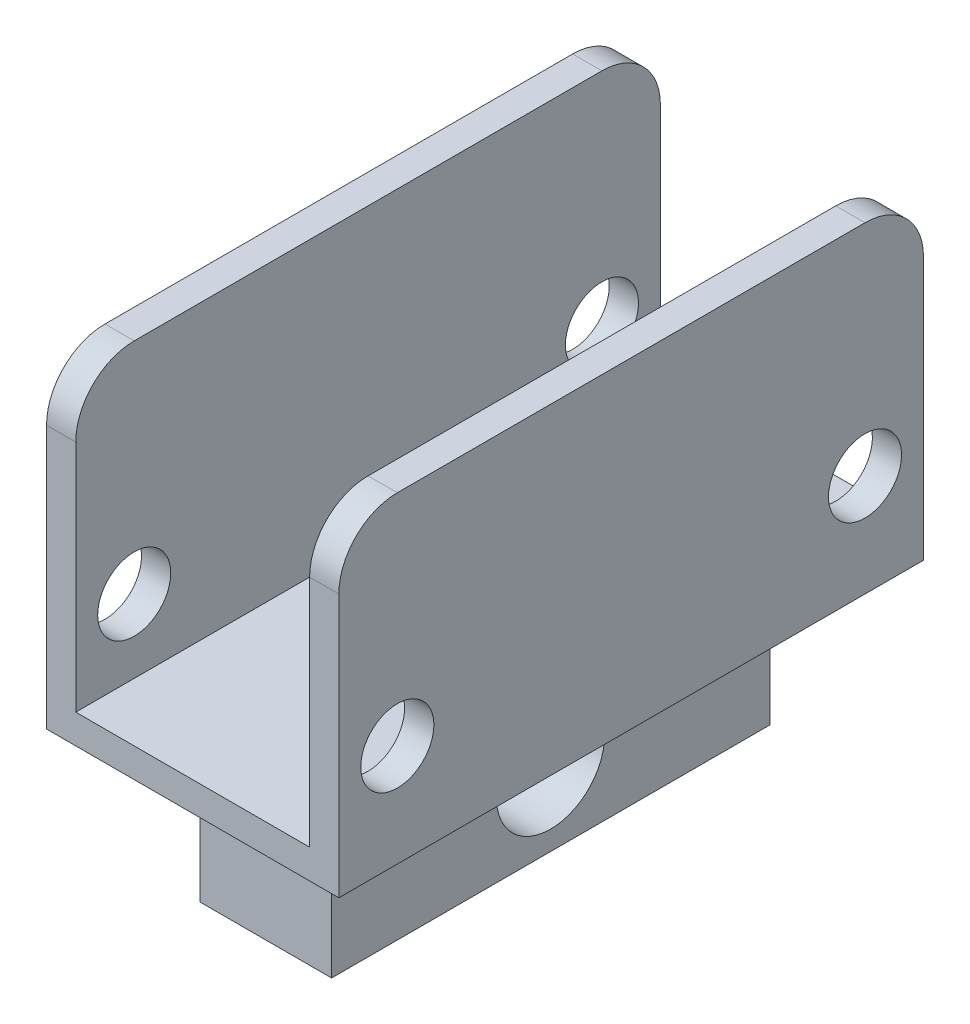
ISO-10303-21;
HEADER;
FILE_DESCRIPTION(('STEP AP214'),'2;1');
FILE_NAME('part.step','',(''),(''),'','','');
FILE_SCHEMA(('AUTOMOTIVE_DESIGN { 1 0 10303 214 1 1 1 1 }'));
ENDSEC;
DATA;
#1=APPLICATION_CONTEXT('core data for automotive mechanical design processes');
#2=APPLICATION_PROTOCOL_DEFINITION('international standard','automotive_design',2000,#1);
#3=PRODUCT_CONTEXT('',#1,'mechanical');
#4=PRODUCT('Part','Part','',(#3));
#5=PRODUCT_RELATED_PRODUCT_CATEGORY('part','',(#4));
#6=PRODUCT_DEFINITION_FORMATION('','',#4);
#7=PRODUCT_DEFINITION_CONTEXT('part definition',#1,'design');
#8=PRODUCT_DEFINITION('design','',#6,#7);
#9=PRODUCT_DEFINITION_SHAPE('','',#8);
#10=(LENGTH_UNIT() NAMED_UNIT(*) SI_UNIT(.MILLI.,.METRE.));
#11=(NAMED_UNIT(*) PLANE_ANGLE_UNIT() SI_UNIT($,.RADIAN.));
#12=(NAMED_UNIT(*) SI_UNIT($,.STERADIAN.) SOLID_ANGLE_UNIT());
#13=UNCERTAINTY_MEASURE_WITH_UNIT(LENGTH_MEASURE(1.E-05),#10,'distance_accuracy_value','');
#14=(GEOMETRIC_REPRESENTATION_CONTEXT(3) GLOBAL_UNCERTAINTY_ASSIGNED_CONTEXT((#13)) GLOBAL_UNIT_ASSIGNED_CONTEXT((#10,
#11,#12)) REPRESENTATION_CONTEXT('',''));
#15=CARTESIAN_POINT('',(0.,0.,0.));
#16=DIRECTION('',(0.,0.,1.));
#17=DIRECTION('',(1.,0.,0.));
#18=AXIS2_PLACEMENT_3D('',#15,#16,#17);
#19=CARTESIAN_POINT('',(10.16,-2.54,50.8));
#20=DIRECTION('',(0.,1.,0.));
#21=DIRECTION('',(0.,0.,1.));
#22=AXIS2_PLACEMENT_3D('',#19,#20,#21);
#23=PLANE('',#22);
#24=DIRECTION('',(1.,0.,0.));
#25=VECTOR('',#24,1.);
#26=CARTESIAN_POINT('',(10.16,-2.54,0.));
#27=LINE('',#26,#25);
#28=CARTESIAN_POINT('',(-12.7,-2.54,0.));
#29=VERTEX_POINT('',#28);
#30=CARTESIAN_POINT('',(12.7,-2.54,0.));
#31=VERTEX_POINT('',#30);
#32=EDGE_CURVE('E215',#29,#31,#27,.T.);
#33=ORIENTED_EDGE('',*,*,#32,.T.);
#34=DIRECTION('',(0.,0.,-1.));
#35=VECTOR('',#34,1.);
#36=CARTESIAN_POINT('',(12.7,-2.54,50.8));
#37=LINE('',#36,#35);
#38=CARTESIAN_POINT('',(12.7,-2.54,50.8));
#39=VERTEX_POINT('',#38);
#40=EDGE_CURVE('E227',#39,#31,#37,.T.);
#41=ORIENTED_EDGE('',*,*,#40,.F.);
#42=DIRECTION('',(1.,0.,0.));
#43=VECTOR('',#42,1.);
#44=CARTESIAN_POINT('',(10.16,-2.54,50.8));
#45=LINE('',#44,#43);
#46=CARTESIAN_POINT('',(-12.7,-2.54,50.8));
#47=VERTEX_POINT('',#46);
#48=EDGE_CURVE('E225',#47,#39,#45,.T.);
#49=ORIENTED_EDGE('',*,*,#48,.F.);
#50=DIRECTION('',(0.,0.,-1.));
#51=VECTOR('',#50,1.);
#52=CARTESIAN_POINT('',(-12.7,-2.54,50.8));
#53=LINE('',#52,#51);
#54=EDGE_CURVE('E243',#47,#29,#53,.T.);
#55=ORIENTED_EDGE('',*,*,#54,.T.);
#56=EDGE_LOOP('',(#33,#41,#49,#55));
#57=FACE_BOUND('',#56,.T.);
#58=DIRECTION('',(0.,0.,1.));
#59=VECTOR('',#58,1.);
#60=CARTESIAN_POINT('',(5.71999999999999,-2.54,6.34999999999999));
#61=LINE('',#60,#59);
#62=CARTESIAN_POINT('',(5.71999999999999,-2.54,6.34999999999999));
#63=VERTEX_POINT('',#62);
#64=CARTESIAN_POINT('',(5.71999999999999,-2.54,44.45));
#65=VERTEX_POINT('',#64);
#66=EDGE_CURVE('E63',#63,#65,#61,.T.);
#67=ORIENTED_EDGE('',*,*,#66,.F.);
#68=DIRECTION('',(1.,0.,0.));
#69=VECTOR('',#68,1.);
#70=CARTESIAN_POINT('',(5.71999999999999,-2.54,6.34999999999999));
#71=LINE('',#70,#69);
#72=CARTESIAN_POINT('',(-5.71999999999999,-2.54,6.34999999999999));
#73=VERTEX_POINT('',#72);
#74=EDGE_CURVE('E67',#73,#63,#71,.T.);
#75=ORIENTED_EDGE('',*,*,#74,.F.);
#76=DIRECTION('',(0.,0.,-1.));
#77=VECTOR('',#76,1.);
#78=CARTESIAN_POINT('',(-5.71999999999999,-2.54,6.34999999999999));
#79=LINE('',#78,#77);
#80=CARTESIAN_POINT('',(-5.71999999999999,-2.54,44.45));
#81=VERTEX_POINT('',#80);
#82=EDGE_CURVE('E578',#81,#73,#79,.T.);
#83=ORIENTED_EDGE('',*,*,#82,.F.);
#84=DIRECTION('',(-1.,0.,0.));
#85=VECTOR('',#84,1.);
#86=CARTESIAN_POINT('',(-5.71999999999999,-2.54,44.45));
#87=LINE('',#86,#85);
#88=EDGE_CURVE('E570',#65,#81,#87,.T.);
#89=ORIENTED_EDGE('',*,*,#88,.F.);
#90=EDGE_LOOP('',(#67,#75,#83,#89));
#91=FACE_BOUND('',#90,.T.);
#92=ADVANCED_FACE('F47',(#57,#91),#23,.F.);
#93=CARTESIAN_POINT('',(12.7,0.,50.8));
#94=DIRECTION('',(-1.,0.,0.));
#95=DIRECTION('',(0.,0.,1.));
#96=AXIS2_PLACEMENT_3D('',#93,#94,#95);
#97=PLANE('',#96);
#98=CARTESIAN_POINT('',(12.7,6.35,45.72));
#99=DIRECTION('',(-1.,0.,0.));
#100=DIRECTION('',(0.,0.,1.));
#101=AXIS2_PLACEMENT_3D('',#98,#99,#100);
#102=CIRCLE('',#101,3.175);
#103=CARTESIAN_POINT('',(12.7,6.35,48.895));
#104=VERTEX_POINT('',#103);
#105=EDGE_CURVE('E190',#104,#104,#102,.T.);
#106=ORIENTED_EDGE('',*,*,#105,.T.);
#107=EDGE_LOOP('',(#106));
#108=FACE_BOUND('',#107,.T.);
#109=CARTESIAN_POINT('',(12.7,6.35,5.08));
#110=DIRECTION('',(-1.,0.,0.));
#111=DIRECTION('',(0.,0.,1.));
#112=AXIS2_PLACEMENT_3D('',#109,#110,#111);
#113=CIRCLE('',#112,3.175);
#114=CARTESIAN_POINT('',(12.7,6.35,8.255));
#115=VERTEX_POINT('',#114);
#116=EDGE_CURVE('E181',#115,#115,#113,.T.);
#117=ORIENTED_EDGE('',*,*,#116,.T.);
#118=EDGE_LOOP('',(#117));
#119=FACE_BOUND('',#118,.T.);
#120=DIRECTION('',(0.,0.,-1.));
#121=VECTOR('',#120,1.);
#122=CARTESIAN_POINT('',(12.7,25.4,50.8));
#123=LINE('',#122,#121);
#124=CARTESIAN_POINT('',(12.7,25.4,45.72));
#125=VERTEX_POINT('',#124);
#126=CARTESIAN_POINT('',(12.7,25.4,5.08));
#127=VERTEX_POINT('',#126);
#128=EDGE_CURVE('E260',#125,#127,#123,.T.);
#129=ORIENTED_EDGE('',*,*,#128,.F.);
#130=CARTESIAN_POINT('',(12.7,20.32,45.72));
#131=DIRECTION('',(-1.,0.,0.));
#132=DIRECTION('',(0.,0.,1.));
#133=AXIS2_PLACEMENT_3D('',#130,#131,#132);
#134=CIRCLE('',#133,5.08);
#135=CARTESIAN_POINT('',(12.7,20.32,50.8));
#136=VERTEX_POINT('',#135);
#137=EDGE_CURVE('E270',#125,#136,#134,.F.);
#138=ORIENTED_EDGE('',*,*,#137,.T.);
#139=DIRECTION('',(0.,1.,0.));
#140=VECTOR('',#139,1.);
#141=CARTESIAN_POINT('',(12.7,0.,50.8));
#142=LINE('',#141,#140);
#143=EDGE_CURVE('E211',#39,#136,#142,.T.);
#144=ORIENTED_EDGE('',*,*,#143,.F.);
#145=ORIENTED_EDGE('',*,*,#40,.T.);
#146=DIRECTION('',(0.,1.,0.));
#147=VECTOR('',#146,1.);
#148=CARTESIAN_POINT('',(12.7,0.,0.));
#149=LINE('',#148,#147);
#150=CARTESIAN_POINT('',(12.7,20.32,0.));
#151=VERTEX_POINT('',#150);
#152=EDGE_CURVE('E210',#31,#151,#149,.T.);
#153=ORIENTED_EDGE('',*,*,#152,.T.);
#154=CARTESIAN_POINT('',(12.7,20.32,5.08));
#155=DIRECTION('',(-1.,0.,0.));
#156=DIRECTION('',(0.,0.,1.));
#157=AXIS2_PLACEMENT_3D('',#154,#155,#156);
#158=CIRCLE('',#157,5.08);
#159=EDGE_CURVE('E268',#151,#127,#158,.F.);
#160=ORIENTED_EDGE('',*,*,#159,.T.);
#161=EDGE_LOOP('',(#129,#138,#144,#145,#153,#160));
#162=FACE_BOUND('',#161,.T.);
#163=ADVANCED_FACE('F305',(#108,#119,#162),#97,.F.);
#164=CARTESIAN_POINT('',(10.16,25.4,50.8));
#165=DIRECTION('',(0.,1.,0.));
#166=DIRECTION('',(0.,0.,1.));
#167=AXIS2_PLACEMENT_3D('',#164,#165,#166);
#168=PLANE('',#167);
#169=DIRECTION('',(0.,0.,-1.));
#170=VECTOR('',#169,1.);
#171=CARTESIAN_POINT('',(10.16,25.4,50.8));
#172=LINE('',#171,#170);
#173=CARTESIAN_POINT('',(10.16,25.4,45.72));
#174=VERTEX_POINT('',#173);
#175=CARTESIAN_POINT('',(10.16,25.4,5.08));
#176=VERTEX_POINT('',#175);
#177=EDGE_CURVE('E257',#174,#176,#172,.T.);
#178=ORIENTED_EDGE('',*,*,#177,.F.);
#179=DIRECTION('',(1.,0.,0.));
#180=VECTOR('',#179,1.);
#181=CARTESIAN_POINT('',(12.7,25.4,45.72));
#182=LINE('',#181,#180);
#183=EDGE_CURVE('E265',#174,#125,#182,.T.);
#184=ORIENTED_EDGE('',*,*,#183,.T.);
#185=ORIENTED_EDGE('',*,*,#128,.T.);
#186=DIRECTION('',(1.,0.,0.));
#187=VECTOR('',#186,1.);
#188=CARTESIAN_POINT('',(10.16,25.4,5.08));
#189=LINE('',#188,#187);
#190=EDGE_CURVE('E263',#127,#176,#189,.F.);
#191=ORIENTED_EDGE('',*,*,#190,.T.);
#192=EDGE_LOOP('',(#178,#184,#185,#191));
#193=FACE_BOUND('',#192,.T.);
#194=ADVANCED_FACE('F344',(#193),#168,.T.);
#195=CARTESIAN_POINT('',(10.16,0.,50.8));
#196=DIRECTION('',(-1.,0.,0.));
#197=DIRECTION('',(0.,0.,1.));
#198=AXIS2_PLACEMENT_3D('',#195,#196,#197);
#199=PLANE('',#198);
#200=CARTESIAN_POINT('',(10.16,6.35,45.72));
#201=DIRECTION('',(-1.,0.,0.));
#202=DIRECTION('',(0.,0.,1.));
#203=AXIS2_PLACEMENT_3D('',#200,#201,#202);
#204=CIRCLE('',#203,3.175);
#205=CARTESIAN_POINT('',(10.16,6.35,48.895));
#206=VERTEX_POINT('',#205);
#207=EDGE_CURVE('E207',#206,#206,#204,.T.);
#208=ORIENTED_EDGE('',*,*,#207,.F.);
#209=EDGE_LOOP('',(#208));
#210=FACE_BOUND('',#209,.T.);
#211=CARTESIAN_POINT('',(10.16,6.35,5.08));
#212=DIRECTION('',(-1.,0.,0.));
#213=DIRECTION('',(0.,0.,1.));
#214=AXIS2_PLACEMENT_3D('',#211,#212,#213);
#215=CIRCLE('',#214,3.175);
#216=CARTESIAN_POINT('',(10.16,6.35,8.255));
#217=VERTEX_POINT('',#216);
#218=EDGE_CURVE('E201',#217,#217,#215,.T.);
#219=ORIENTED_EDGE('',*,*,#218,.F.);
#220=EDGE_LOOP('',(#219));
#221=FACE_BOUND('',#220,.T.);
#222=DIRECTION('',(0.,1.,0.));
#223=VECTOR('',#222,1.);
#224=CARTESIAN_POINT('',(10.16,0.,50.8));
#225=LINE('',#224,#223);
#226=CARTESIAN_POINT('',(10.16,0.,50.8));
#227=VERTEX_POINT('',#226);
#228=CARTESIAN_POINT('',(10.16,20.32,50.8));
#229=VERTEX_POINT('',#228);
#230=EDGE_CURVE('E214',#227,#229,#225,.T.);
#231=ORIENTED_EDGE('',*,*,#230,.T.);
#232=CARTESIAN_POINT('',(10.16,20.32,45.72));
#233=DIRECTION('',(-1.,0.,0.));
#234=DIRECTION('',(0.,0.,1.));
#235=AXIS2_PLACEMENT_3D('',#232,#233,#234);
#236=CIRCLE('',#235,5.08);
#237=EDGE_CURVE('E278',#229,#174,#236,.T.);
#238=ORIENTED_EDGE('',*,*,#237,.T.);
#239=ORIENTED_EDGE('',*,*,#177,.T.);
#240=CARTESIAN_POINT('',(10.16,20.32,5.08));
#241=DIRECTION('',(-1.,0.,0.));
#242=DIRECTION('',(0.,0.,1.));
#243=AXIS2_PLACEMENT_3D('',#240,#241,#242);
#244=CIRCLE('',#243,5.08);
#245=CARTESIAN_POINT('',(10.16,20.32,0.));
#246=VERTEX_POINT('',#245);
#247=EDGE_CURVE('E276',#176,#246,#244,.T.);
#248=ORIENTED_EDGE('',*,*,#247,.T.);
#249=DIRECTION('',(0.,1.,0.));
#250=VECTOR('',#249,1.);
#251=CARTESIAN_POINT('',(10.16,0.,0.));
#252=LINE('',#251,#250);
#253=CARTESIAN_POINT('',(10.16,0.,0.));
#254=VERTEX_POINT('',#253);
#255=EDGE_CURVE('E230',#254,#246,#252,.T.);
#256=ORIENTED_EDGE('',*,*,#255,.F.);
#257=DIRECTION('',(0.,0.,-1.));
#258=VECTOR('',#257,1.);
#259=CARTESIAN_POINT('',(10.16,0.,50.8));
#260=LINE('',#259,#258);
#261=EDGE_CURVE('E255',#227,#254,#260,.T.);
#262=ORIENTED_EDGE('',*,*,#261,.F.);
#263=EDGE_LOOP('',(#231,#238,#239,#248,#256,#262));
#264=FACE_BOUND('',#263,.T.);
#265=ADVANCED_FACE('F340',(#210,#221,#264),#199,.T.);
#266=CARTESIAN_POINT('',(10.16,0.,50.8));
#267=DIRECTION('',(0.,1.,0.));
#268=DIRECTION('',(0.,0.,1.));
#269=AXIS2_PLACEMENT_3D('',#266,#267,#268);
#270=PLANE('',#269);
#271=DIRECTION('',(1.,0.,0.));
#272=VECTOR('',#271,1.);
#273=CARTESIAN_POINT('',(10.16,0.,0.));
#274=LINE('',#273,#272);
#275=CARTESIAN_POINT('',(-10.16,0.,0.));
#276=VERTEX_POINT('',#275);
#277=EDGE_CURVE('E233',#276,#254,#274,.T.);
#278=ORIENTED_EDGE('',*,*,#277,.F.);
#279=DIRECTION('',(0.,0.,-1.));
#280=VECTOR('',#279,1.);
#281=CARTESIAN_POINT('',(-10.16,0.,50.8));
#282=LINE('',#281,#280);
#283=CARTESIAN_POINT('',(-10.16,0.,50.8));
#284=VERTEX_POINT('',#283);
#285=EDGE_CURVE('E252',#284,#276,#282,.T.);
#286=ORIENTED_EDGE('',*,*,#285,.F.);
#287=DIRECTION('',(1.,0.,0.));
#288=VECTOR('',#287,1.);
#289=CARTESIAN_POINT('',(10.16,0.,50.8));
#290=LINE('',#289,#288);
#291=EDGE_CURVE('E218',#284,#227,#290,.T.);
#292=ORIENTED_EDGE('',*,*,#291,.T.);
#293=ORIENTED_EDGE('',*,*,#261,.T.);
#294=EDGE_LOOP('',(#278,#286,#292,#293));
#295=FACE_BOUND('',#294,.T.);
#296=ADVANCED_FACE('F338',(#295),#270,.T.);
#297=CARTESIAN_POINT('',(-10.16,0.,50.8));
#298=DIRECTION('',(1.,0.,0.));
#299=DIRECTION('',(0.,0.,-1.));
#300=AXIS2_PLACEMENT_3D('',#297,#298,#299);
#301=PLANE('',#300);
#302=CARTESIAN_POINT('',(-10.16,6.35,45.72));
#303=DIRECTION('',(1.,0.,0.));
#304=DIRECTION('',(0.,0.,-1.));
#305=AXIS2_PLACEMENT_3D('',#302,#303,#304);
#306=CIRCLE('',#305,3.175);
#307=CARTESIAN_POINT('',(-10.16,6.35,48.895));
#308=VERTEX_POINT('',#307);
#309=EDGE_CURVE('E204',#308,#308,#306,.T.);
#310=ORIENTED_EDGE('',*,*,#309,.F.);
#311=EDGE_LOOP('',(#310));
#312=FACE_BOUND('',#311,.T.);
#313=CARTESIAN_POINT('',(-10.16,6.35,5.08));
#314=DIRECTION('',(1.,0.,0.));
#315=DIRECTION('',(0.,0.,-1.));
#316=AXIS2_PLACEMENT_3D('',#313,#314,#315);
#317=CIRCLE('',#316,3.175);
#318=CARTESIAN_POINT('',(-10.16,6.35,8.255));
#319=VERTEX_POINT('',#318);
#320=EDGE_CURVE('E193',#319,#319,#317,.T.);
#321=ORIENTED_EDGE('',*,*,#320,.F.);
#322=EDGE_LOOP('',(#321));
#323=FACE_BOUND('',#322,.T.);
#324=DIRECTION('',(0.,0.,-1.));
#325=VECTOR('',#324,1.);
#326=CARTESIAN_POINT('',(-10.16,25.4,50.8));
#327=LINE('',#326,#325);
#328=CARTESIAN_POINT('',(-10.16,25.4,45.72));
#329=VERTEX_POINT('',#328);
#330=CARTESIAN_POINT('',(-10.16,25.4,5.08));
#331=VERTEX_POINT('',#330);
#332=EDGE_CURVE('E249',#329,#331,#327,.T.);
#333=ORIENTED_EDGE('',*,*,#332,.F.);
#334=CARTESIAN_POINT('',(-10.16,20.32,45.72));
#335=DIRECTION('',(1.,0.,0.));
#336=DIRECTION('',(0.,0.,-1.));
#337=AXIS2_PLACEMENT_3D('',#334,#335,#336);
#338=CIRCLE('',#337,5.08);
#339=CARTESIAN_POINT('',(-10.16,20.32,50.8));
#340=VERTEX_POINT('',#339);
#341=EDGE_CURVE('E287',#329,#340,#338,.T.);
#342=ORIENTED_EDGE('',*,*,#341,.T.);
#343=DIRECTION('',(0.,-1.,0.));
#344=VECTOR('',#343,1.);
#345=CARTESIAN_POINT('',(-10.16,0.,50.8));
#346=LINE('',#345,#344);
#347=EDGE_CURVE('E221',#340,#284,#346,.T.);
#348=ORIENTED_EDGE('',*,*,#347,.T.);
#349=ORIENTED_EDGE('',*,*,#285,.T.);
#350=DIRECTION('',(0.,-1.,0.));
#351=VECTOR('',#350,1.);
#352=CARTESIAN_POINT('',(-10.16,0.,0.));
#353=LINE('',#352,#351);
#354=CARTESIAN_POINT('',(-10.16,20.32,0.));
#355=VERTEX_POINT('',#354);
#356=EDGE_CURVE('E236',#355,#276,#353,.T.);
#357=ORIENTED_EDGE('',*,*,#356,.F.);
#358=CARTESIAN_POINT('',(-10.16,20.32,5.08));
#359=DIRECTION('',(1.,0.,0.));
#360=DIRECTION('',(0.,0.,-1.));
#361=AXIS2_PLACEMENT_3D('',#358,#359,#360);
#362=CIRCLE('',#361,5.08);
#363=EDGE_CURVE('E285',#355,#331,#362,.T.);
#364=ORIENTED_EDGE('',*,*,#363,.T.);
#365=EDGE_LOOP('',(#333,#342,#348,#349,#357,#364));
#366=FACE_BOUND('',#365,.T.);
#367=ADVANCED_FACE('F320',(#312,#323,#366),#301,.T.);
#368=CARTESIAN_POINT('',(-12.7,25.4,50.8));
#369=DIRECTION('',(0.,1.,0.));
#370=DIRECTION('',(0.,0.,1.));
#371=AXIS2_PLACEMENT_3D('',#368,#369,#370);
#372=PLANE('',#371);
#373=DIRECTION('',(0.,0.,-1.));
#374=VECTOR('',#373,1.);
#375=CARTESIAN_POINT('',(-12.7,25.4,50.8));
#376=LINE('',#375,#374);
#377=CARTESIAN_POINT('',(-12.7,25.4,45.72));
#378=VERTEX_POINT('',#377);
#379=CARTESIAN_POINT('',(-12.7,25.4,5.08));
#380=VERTEX_POINT('',#379);
#381=EDGE_CURVE('E246',#378,#380,#376,.T.);
#382=ORIENTED_EDGE('',*,*,#381,.F.);
#383=DIRECTION('',(1.,0.,0.));
#384=VECTOR('',#383,1.);
#385=CARTESIAN_POINT('',(-10.16,25.4,45.72));
#386=LINE('',#385,#384);
#387=EDGE_CURVE('E282',#378,#329,#386,.T.);
#388=ORIENTED_EDGE('',*,*,#387,.T.);
#389=ORIENTED_EDGE('',*,*,#332,.T.);
#390=DIRECTION('',(1.,0.,0.));
#391=VECTOR('',#390,1.);
#392=CARTESIAN_POINT('',(-12.7,25.4,5.08));
#393=LINE('',#392,#391);
#394=EDGE_CURVE('E280',#331,#380,#393,.F.);
#395=ORIENTED_EDGE('',*,*,#394,.T.);
#396=EDGE_LOOP('',(#382,#388,#389,#395));
#397=FACE_BOUND('',#396,.T.);
#398=ADVANCED_FACE('F323',(#397),#372,.T.);
#399=CARTESIAN_POINT('',(-12.7,0.,50.8));
#400=DIRECTION('',(1.,0.,0.));
#401=DIRECTION('',(0.,0.,-1.));
#402=AXIS2_PLACEMENT_3D('',#399,#400,#401);
#403=PLANE('',#402);
#404=CARTESIAN_POINT('',(-12.7,6.35,45.72));
#405=DIRECTION('',(-1.,0.,0.));
#406=DIRECTION('',(0.,0.,1.));
#407=AXIS2_PLACEMENT_3D('',#404,#405,#406);
#408=CIRCLE('',#407,3.175);
#409=CARTESIAN_POINT('',(-12.7,6.35,48.895));
#410=VERTEX_POINT('',#409);
#411=EDGE_CURVE('E194',#410,#410,#408,.T.);
#412=ORIENTED_EDGE('',*,*,#411,.F.);
#413=EDGE_LOOP('',(#412));
#414=FACE_BOUND('',#413,.T.);
#415=CARTESIAN_POINT('',(-12.7,6.35,5.08));
#416=DIRECTION('',(-1.,0.,0.));
#417=DIRECTION('',(0.,0.,1.));
#418=AXIS2_PLACEMENT_3D('',#415,#416,#417);
#419=CIRCLE('',#418,3.175);
#420=CARTESIAN_POINT('',(-12.7,6.35,8.255));
#421=VERTEX_POINT('',#420);
#422=EDGE_CURVE('E184',#421,#421,#419,.T.);
#423=ORIENTED_EDGE('',*,*,#422,.F.);
#424=EDGE_LOOP('',(#423));
#425=FACE_BOUND('',#424,.T.);
#426=DIRECTION('',(0.,1.,0.));
#427=VECTOR('',#426,1.);
#428=CARTESIAN_POINT('',(-12.7,0.,50.8));
#429=LINE('',#428,#427);
#430=CARTESIAN_POINT('',(-12.7,20.32,50.8));
#431=VERTEX_POINT('',#430);
#432=EDGE_CURVE('E223',#431,#47,#429,.F.);
#433=ORIENTED_EDGE('',*,*,#432,.F.);
#434=CARTESIAN_POINT('',(-12.7,20.32,45.72));
#435=DIRECTION('',(1.,0.,0.));
#436=DIRECTION('',(0.,0.,-1.));
#437=AXIS2_PLACEMENT_3D('',#434,#435,#436);
#438=CIRCLE('',#437,5.08);
#439=EDGE_CURVE('E291',#431,#378,#438,.F.);
#440=ORIENTED_EDGE('',*,*,#439,.T.);
#441=ORIENTED_EDGE('',*,*,#381,.T.);
#442=CARTESIAN_POINT('',(-12.7,20.32,5.08));
#443=DIRECTION('',(1.,0.,0.));
#444=DIRECTION('',(0.,0.,-1.));
#445=AXIS2_PLACEMENT_3D('',#442,#443,#444);
#446=CIRCLE('',#445,5.08);
#447=CARTESIAN_POINT('',(-12.7,20.32,0.));
#448=VERTEX_POINT('',#447);
#449=EDGE_CURVE('E289',#380,#448,#446,.F.);
#450=ORIENTED_EDGE('',*,*,#449,.T.);
#451=DIRECTION('',(0.,1.,0.));
#452=VECTOR('',#451,1.);
#453=CARTESIAN_POINT('',(-12.7,0.,0.));
#454=LINE('',#453,#452);
#455=EDGE_CURVE('E238',#448,#29,#454,.F.);
#456=ORIENTED_EDGE('',*,*,#455,.T.);
#457=ORIENTED_EDGE('',*,*,#54,.F.);
#458=EDGE_LOOP('',(#433,#440,#441,#450,#456,#457));
#459=FACE_BOUND('',#458,.T.);
#460=ADVANCED_FACE('F366',(#414,#425,#459),#403,.F.);
#461=CARTESIAN_POINT('',(0.,0.,50.8));
#462=DIRECTION('',(0.,0.,-1.));
#463=DIRECTION('',(-1.,0.,0.));
#464=AXIS2_PLACEMENT_3D('',#461,#462,#463);
#465=PLANE('',#464);
#466=ORIENTED_EDGE('',*,*,#143,.T.);
#467=DIRECTION('',(1.,0.,0.));
#468=VECTOR('',#467,1.);
#469=CARTESIAN_POINT('',(10.16,20.32,50.8));
#470=LINE('',#469,#468);
#471=EDGE_CURVE('E274',#136,#229,#470,.F.);
#472=ORIENTED_EDGE('',*,*,#471,.T.);
#473=ORIENTED_EDGE('',*,*,#230,.F.);
#474=ORIENTED_EDGE('',*,*,#291,.F.);
#475=ORIENTED_EDGE('',*,*,#347,.F.);
#476=DIRECTION('',(1.,0.,0.));
#477=VECTOR('',#476,1.);
#478=CARTESIAN_POINT('',(-12.7,20.32,50.8));
#479=LINE('',#478,#477);
#480=EDGE_CURVE('E272',#340,#431,#479,.F.);
#481=ORIENTED_EDGE('',*,*,#480,.T.);
#482=ORIENTED_EDGE('',*,*,#432,.T.);
#483=ORIENTED_EDGE('',*,*,#48,.T.);
#484=EDGE_LOOP('',(#466,#472,#473,#474,#475,#481,#482,#483));
#485=FACE_BOUND('',#484,.T.);
#486=ADVANCED_FACE('F333',(#485),#465,.F.);
#487=CARTESIAN_POINT('',(0.,0.,0.));
#488=DIRECTION('',(0.,0.,-1.));
#489=DIRECTION('',(-1.,0.,0.));
#490=AXIS2_PLACEMENT_3D('',#487,#488,#489);
#491=PLANE('',#490);
#492=ORIENTED_EDGE('',*,*,#455,.F.);
#493=DIRECTION('',(1.,0.,0.));
#494=VECTOR('',#493,1.);
#495=CARTESIAN_POINT('',(0.,20.32,0.));
#496=LINE('',#495,#494);
#497=EDGE_CURVE('E11',#448,#355,#496,.T.);
#498=ORIENTED_EDGE('',*,*,#497,.T.);
#499=ORIENTED_EDGE('',*,*,#356,.T.);
#500=ORIENTED_EDGE('',*,*,#277,.T.);
#501=ORIENTED_EDGE('',*,*,#255,.T.);
#502=DIRECTION('',(1.,0.,0.));
#503=VECTOR('',#502,1.);
#504=CARTESIAN_POINT('',(0.,20.32,0.));
#505=LINE('',#504,#503);
#506=EDGE_CURVE('E56',#246,#151,#505,.T.);
#507=ORIENTED_EDGE('',*,*,#506,.T.);
#508=ORIENTED_EDGE('',*,*,#152,.F.);
#509=ORIENTED_EDGE('',*,*,#32,.F.);
#510=EDGE_LOOP('',(#492,#498,#499,#500,#501,#507,#508,#509));
#511=FACE_BOUND('',#510,.T.);
#512=ADVANCED_FACE('F298',(#511),#491,.T.);
#513=CARTESIAN_POINT('',(10.16,20.32,45.72));
#514=DIRECTION('',(-1.,0.,0.));
#515=DIRECTION('',(0.,0.,1.));
#516=AXIS2_PLACEMENT_3D('',#513,#514,#515);
#517=CYLINDRICAL_SURFACE('',#516,5.08);
#518=ORIENTED_EDGE('',*,*,#237,.F.);
#519=ORIENTED_EDGE('',*,*,#471,.F.);
#520=ORIENTED_EDGE('',*,*,#137,.F.);
#521=ORIENTED_EDGE('',*,*,#183,.F.);
#522=EDGE_LOOP('',(#518,#519,#520,#521));
#523=FACE_BOUND('',#522,.T.);
#524=ADVANCED_FACE('F349',(#523),#517,.T.);
#525=CARTESIAN_POINT('',(-12.7,20.32,45.72));
#526=DIRECTION('',(-1.,0.,0.));
#527=DIRECTION('',(0.,0.,1.));
#528=AXIS2_PLACEMENT_3D('',#525,#526,#527);
#529=CYLINDRICAL_SURFACE('',#528,5.08);
#530=ORIENTED_EDGE('',*,*,#439,.F.);
#531=ORIENTED_EDGE('',*,*,#480,.F.);
#532=ORIENTED_EDGE('',*,*,#341,.F.);
#533=ORIENTED_EDGE('',*,*,#387,.F.);
#534=EDGE_LOOP('',(#530,#531,#532,#533));
#535=FACE_BOUND('',#534,.T.);
#536=ADVANCED_FACE('F327',(#535),#529,.T.);
#537=CARTESIAN_POINT('',(0.,20.32,5.08));
#538=DIRECTION('',(1.,0.,0.));
#539=DIRECTION('',(0.,0.,-1.));
#540=AXIS2_PLACEMENT_3D('',#537,#538,#539);
#541=CYLINDRICAL_SURFACE('',#540,5.08);
#542=ORIENTED_EDGE('',*,*,#449,.F.);
#543=ORIENTED_EDGE('',*,*,#394,.F.);
#544=ORIENTED_EDGE('',*,*,#363,.F.);
#545=ORIENTED_EDGE('',*,*,#497,.F.);
#546=EDGE_LOOP('',(#542,#543,#544,#545));
#547=FACE_BOUND('',#546,.T.);
#548=ADVANCED_FACE('F316',(#547),#541,.T.);
#549=CARTESIAN_POINT('',(0.,20.32,5.08));
#550=DIRECTION('',(1.,0.,0.));
#551=DIRECTION('',(0.,0.,-1.));
#552=AXIS2_PLACEMENT_3D('',#549,#550,#551);
#553=CYLINDRICAL_SURFACE('',#552,5.08);
#554=ORIENTED_EDGE('',*,*,#247,.F.);
#555=ORIENTED_EDGE('',*,*,#190,.F.);
#556=ORIENTED_EDGE('',*,*,#159,.F.);
#557=ORIENTED_EDGE('',*,*,#506,.F.);
#558=EDGE_LOOP('',(#554,#555,#556,#557));
#559=FACE_BOUND('',#558,.T.);
#560=ADVANCED_FACE('F49',(#559),#553,.T.);
#561=CARTESIAN_POINT('',(12.7,6.35,5.08));
#562=DIRECTION('',(-1.,0.,0.));
#563=DIRECTION('',(0.,0.,1.));
#564=AXIS2_PLACEMENT_3D('',#561,#562,#563);
#565=CYLINDRICAL_SURFACE('',#564,3.175);
#566=CARTESIAN_POINT('',(-10.16,6.35,8.255));
#567=CARTESIAN_POINT('',(-10.1864583333333,6.35,8.255));
#568=CARTESIAN_POINT('',(-10.2129166666667,6.35,8.255));
#569=CARTESIAN_POINT('',(-10.2658333333333,6.35,8.255));
#570=CARTESIAN_POINT('',(-10.2922916666667,6.35,8.255));
#571=CARTESIAN_POINT('',(-10.3452083333333,6.35,8.255));
#572=CARTESIAN_POINT('',(-10.3716666666667,6.35,8.255));
#573=CARTESIAN_POINT('',(-10.4245833333333,6.35,8.255));
#574=CARTESIAN_POINT('',(-10.4510416666667,6.35,8.255));
#575=CARTESIAN_POINT('',(-10.5039583333333,6.35,8.255));
#576=CARTESIAN_POINT('',(-10.5304166666667,6.35,8.255));
#577=CARTESIAN_POINT('',(-10.5833333333333,6.35,8.255));
#578=CARTESIAN_POINT('',(-10.6097916666667,6.35,8.255));
#579=CARTESIAN_POINT('',(-10.6627083333333,6.35,8.255));
#580=CARTESIAN_POINT('',(-10.6891666666667,6.35,8.255));
#581=CARTESIAN_POINT('',(-10.7420833333333,6.35,8.255));
#582=CARTESIAN_POINT('',(-10.7685416666667,6.35,8.255));
#583=CARTESIAN_POINT('',(-10.8214583333333,6.35,8.255));
#584=CARTESIAN_POINT('',(-10.8479166666667,6.35,8.255));
#585=CARTESIAN_POINT('',(-10.9008333333333,6.35,8.255));
#586=CARTESIAN_POINT('',(-10.9272916666667,6.35,8.255));
#587=CARTESIAN_POINT('',(-10.9802083333333,6.35,8.255));
#588=CARTESIAN_POINT('',(-11.0066666666667,6.35,8.255));
#589=CARTESIAN_POINT('',(-11.0595833333333,6.35,8.255));
#590=CARTESIAN_POINT('',(-11.0860416666667,6.35,8.255));
#591=CARTESIAN_POINT('',(-11.1389583333333,6.35,8.255));
#592=CARTESIAN_POINT('',(-11.1654166666667,6.35,8.255));
#593=CARTESIAN_POINT('',(-11.2183333333333,6.35,8.255));
#594=CARTESIAN_POINT('',(-11.2447916666667,6.35,8.255));
#595=CARTESIAN_POINT('',(-11.2977083333333,6.35,8.255));
#596=CARTESIAN_POINT('',(-11.3241666666667,6.35,8.255));
#597=CARTESIAN_POINT('',(-11.3770833333333,6.35,8.255));
#598=CARTESIAN_POINT('',(-11.4035416666667,6.35,8.255));
#599=CARTESIAN_POINT('',(-11.4564583333333,6.35,8.255));
#600=CARTESIAN_POINT('',(-11.4829166666667,6.35,8.255));
#601=CARTESIAN_POINT('',(-11.5358333333333,6.35,8.255));
#602=CARTESIAN_POINT('',(-11.5622916666667,6.35,8.255));
#603=CARTESIAN_POINT('',(-11.6152083333333,6.35,8.255));
#604=CARTESIAN_POINT('',(-11.6416666666667,6.35,8.255));
#605=CARTESIAN_POINT('',(-11.6945833333333,6.35,8.255));
#606=CARTESIAN_POINT('',(-11.7210416666667,6.35,8.255));
#607=CARTESIAN_POINT('',(-11.7739583333333,6.35,8.255));
#608=CARTESIAN_POINT('',(-11.8004166666667,6.35,8.255));
#609=CARTESIAN_POINT('',(-11.8533333333333,6.35,8.255));
#610=CARTESIAN_POINT('',(-11.8797916666667,6.35,8.255));
#611=CARTESIAN_POINT('',(-11.9327083333333,6.35,8.255));
#612=CARTESIAN_POINT('',(-11.9591666666667,6.35,8.255));
#613=CARTESIAN_POINT('',(-12.0120833333333,6.35,8.255));
#614=CARTESIAN_POINT('',(-12.0385416666667,6.35,8.255));
#615=CARTESIAN_POINT('',(-12.0914583333333,6.35,8.255));
#616=CARTESIAN_POINT('',(-12.1179166666667,6.35,8.255));
#617=CARTESIAN_POINT('',(-12.1708333333333,6.35,8.255));
#618=CARTESIAN_POINT('',(-12.1972916666667,6.35,8.255));
#619=CARTESIAN_POINT('',(-12.2502083333333,6.35,8.255));
#620=CARTESIAN_POINT('',(-12.2766666666667,6.35,8.255));
#621=CARTESIAN_POINT('',(-12.3295833333333,6.35,8.255));
#622=CARTESIAN_POINT('',(-12.3560416666667,6.35,8.255));
#623=CARTESIAN_POINT('',(-12.4089583333333,6.35,8.255));
#624=CARTESIAN_POINT('',(-12.4354166666667,6.35,8.255));
#625=CARTESIAN_POINT('',(-12.4883333333333,6.35,8.255));
#626=CARTESIAN_POINT('',(-12.5147916666667,6.35,8.255));
#627=CARTESIAN_POINT('',(-12.5677083333333,6.35,8.255));
#628=CARTESIAN_POINT('',(-12.5941666666667,6.35,8.255));
#629=CARTESIAN_POINT('',(-12.6470833333333,6.35,8.255));
#630=CARTESIAN_POINT('',(-12.6735416666667,6.35,8.255));
#631=CARTESIAN_POINT('',(-12.7,6.35,8.255));
#632=B_SPLINE_CURVE_WITH_KNOTS('',3,(#566,#567,#568,#569,#570,#571,#572,#573,#574,#575,#576,
#577,#578,#579,#580,#581,#582,#583,#584,#585,#586,#587,#588,#589,#590,#591,#592,#593,#594,#595,
#596,#597,#598,#599,#600,#601,#602,#603,#604,#605,#606,#607,#608,#609,#610,#611,#612,#613,#614,
#615,#616,#617,#618,#619,#620,#621,#622,#623,#624,#625,#626,#627,#628,#629,#630,#631),
.UNSPECIFIED.,.F.,.F.,(4,2,2,2,2,2,2,2,2,2,2,2,2,2,2,2,2,2,2,2,2,2,2,2,2,2,2,2,2,2,2,2,4),(0.,
0.0793749999999996,0.158749999999999,0.238124999999999,0.317499999999998,0.396875000000001,
0.476250000000001,0.555625000000001,0.635,0.714375,0.793749999999999,0.873124999999999,
0.952500000000002,1.031875,1.11125,1.190625,1.27,1.349375,1.42875,1.508125,1.5875,1.666875,
1.74625,1.825625,1.905,1.984375,2.06375,2.143125,2.2225,2.301875,2.38125,2.460625,2.54),.UNSPECIFIED.);
#633=EDGE_CURVE('BSEAM432',#319,#421,#632,.T.);
#634=ORIENTED_EDGE('',*,*,#320,.T.);
#635=ORIENTED_EDGE('',*,*,#422,.T.);
#636=ORIENTED_EDGE('',*,*,#633,.T.);
#637=ORIENTED_EDGE('',*,*,#633,.F.);
#638=EDGE_LOOP('',(#634,#636,#635,#637));
#639=FACE_BOUND('',#638,.T.);
#640=ADVANCED_FACE('F432',(#639),#565,.F.);
#641=CARTESIAN_POINT('',(12.7,6.35,45.72));
#642=DIRECTION('',(-1.,0.,0.));
#643=DIRECTION('',(0.,0.,1.));
#644=AXIS2_PLACEMENT_3D('',#641,#642,#643);
#645=CYLINDRICAL_SURFACE('',#644,3.175);
#646=CARTESIAN_POINT('',(-10.16,6.35,48.895));
#647=CARTESIAN_POINT('',(-10.1864583333333,6.35,48.895));
#648=CARTESIAN_POINT('',(-10.2129166666667,6.35,48.895));
#649=CARTESIAN_POINT('',(-10.2658333333333,6.35,48.895));
#650=CARTESIAN_POINT('',(-10.2922916666667,6.35,48.895));
#651=CARTESIAN_POINT('',(-10.3452083333333,6.35,48.895));
#652=CARTESIAN_POINT('',(-10.3716666666667,6.35,48.895));
#653=CARTESIAN_POINT('',(-10.4245833333333,6.35,48.895));
#654=CARTESIAN_POINT('',(-10.4510416666667,6.35,48.895));
#655=CARTESIAN_POINT('',(-10.5039583333333,6.35,48.895));
#656=CARTESIAN_POINT('',(-10.5304166666667,6.35,48.895));
#657=CARTESIAN_POINT('',(-10.5833333333333,6.35,48.895));
#658=CARTESIAN_POINT('',(-10.6097916666667,6.35,48.895));
#659=CARTESIAN_POINT('',(-10.6627083333333,6.35,48.895));
#660=CARTESIAN_POINT('',(-10.6891666666667,6.35,48.895));
#661=CARTESIAN_POINT('',(-10.7420833333333,6.35,48.895));
#662=CARTESIAN_POINT('',(-10.7685416666667,6.35,48.895));
#663=CARTESIAN_POINT('',(-10.8214583333333,6.35,48.895));
#664=CARTESIAN_POINT('',(-10.8479166666667,6.35,48.895));
#665=CARTESIAN_POINT('',(-10.9008333333333,6.35,48.895));
#666=CARTESIAN_POINT('',(-10.9272916666667,6.35,48.895));
#667=CARTESIAN_POINT('',(-10.9802083333333,6.35,48.895));
#668=CARTESIAN_POINT('',(-11.0066666666667,6.35,48.895));
#669=CARTESIAN_POINT('',(-11.0595833333333,6.35,48.895));
#670=CARTESIAN_POINT('',(-11.0860416666667,6.35,48.895));
#671=CARTESIAN_POINT('',(-11.1389583333333,6.35,48.895));
#672=CARTESIAN_POINT('',(-11.1654166666667,6.35,48.895));
#673=CARTESIAN_POINT('',(-11.2183333333333,6.35,48.895));
#674=CARTESIAN_POINT('',(-11.2447916666667,6.35,48.895));
#675=CARTESIAN_POINT('',(-11.2977083333333,6.35,48.895));
#676=CARTESIAN_POINT('',(-11.3241666666667,6.35,48.895));
#677=CARTESIAN_POINT('',(-11.3770833333333,6.35,48.895));
#678=CARTESIAN_POINT('',(-11.4035416666667,6.35,48.895));
#679=CARTESIAN_POINT('',(-11.4564583333333,6.35,48.895));
#680=CARTESIAN_POINT('',(-11.4829166666667,6.35,48.895));
#681=CARTESIAN_POINT('',(-11.5358333333333,6.35,48.895));
#682=CARTESIAN_POINT('',(-11.5622916666667,6.35,48.895));
#683=CARTESIAN_POINT('',(-11.6152083333333,6.35,48.895));
#684=CARTESIAN_POINT('',(-11.6416666666667,6.35,48.895));
#685=CARTESIAN_POINT('',(-11.6945833333333,6.35,48.895));
#686=CARTESIAN_POINT('',(-11.7210416666667,6.35,48.895));
#687=CARTESIAN_POINT('',(-11.7739583333333,6.35,48.895));
#688=CARTESIAN_POINT('',(-11.8004166666667,6.35,48.895));
#689=CARTESIAN_POINT('',(-11.8533333333333,6.35,48.895));
#690=CARTESIAN_POINT('',(-11.8797916666667,6.35,48.895));
#691=CARTESIAN_POINT('',(-11.9327083333333,6.35,48.895));
#692=CARTESIAN_POINT('',(-11.9591666666667,6.35,48.895));
#693=CARTESIAN_POINT('',(-12.0120833333333,6.35,48.895));
#694=CARTESIAN_POINT('',(-12.0385416666667,6.35,48.895));
#695=CARTESIAN_POINT('',(-12.0914583333333,6.35,48.895));
#696=CARTESIAN_POINT('',(-12.1179166666667,6.35,48.895));
#697=CARTESIAN_POINT('',(-12.1708333333333,6.35,48.895));
#698=CARTESIAN_POINT('',(-12.1972916666667,6.35,48.895));
#699=CARTESIAN_POINT('',(-12.2502083333333,6.35,48.895));
#700=CARTESIAN_POINT('',(-12.2766666666667,6.35,48.895));
#701=CARTESIAN_POINT('',(-12.3295833333333,6.35,48.895));
#702=CARTESIAN_POINT('',(-12.3560416666667,6.35,48.895));
#703=CARTESIAN_POINT('',(-12.4089583333333,6.35,48.895));
#704=CARTESIAN_POINT('',(-12.4354166666667,6.35,48.895));
#705=CARTESIAN_POINT('',(-12.4883333333333,6.35,48.895));
#706=CARTESIAN_POINT('',(-12.5147916666667,6.35,48.895));
#707=CARTESIAN_POINT('',(-12.5677083333333,6.35,48.895));
#708=CARTESIAN_POINT('',(-12.5941666666667,6.35,48.895));
#709=CARTESIAN_POINT('',(-12.6470833333333,6.35,48.895));
#710=CARTESIAN_POINT('',(-12.6735416666667,6.35,48.895));
#711=CARTESIAN_POINT('',(-12.7,6.35,48.895));
#712=B_SPLINE_CURVE_WITH_KNOTS('',3,(#646,#647,#648,#649,#650,#651,#652,#653,#654,#655,#656,
#657,#658,#659,#660,#661,#662,#663,#664,#665,#666,#667,#668,#669,#670,#671,#672,#673,#674,#675,
#676,#677,#678,#679,#680,#681,#682,#683,#684,#685,#686,#687,#688,#689,#690,#691,#692,#693,#694,
#695,#696,#697,#698,#699,#700,#701,#702,#703,#704,#705,#706,#707,#708,#709,#710,#711),
.UNSPECIFIED.,.F.,.F.,(4,2,2,2,2,2,2,2,2,2,2,2,2,2,2,2,2,2,2,2,2,2,2,2,2,2,2,2,2,2,2,2,4),(0.,
0.0793749999999996,0.158749999999999,0.238124999999999,0.317499999999998,0.396875000000001,
0.476250000000001,0.555625000000001,0.635,0.714375,0.793749999999999,0.873124999999999,
0.952500000000002,1.031875,1.11125,1.190625,1.27,1.349375,1.42875,1.508125,1.5875,1.666875,
1.74625,1.825625,1.905,1.984375,2.06375,2.143125,2.2225,2.301875,2.38125,2.460625,2.54),.UNSPECIFIED.);
#713=EDGE_CURVE('BSEAM441',#308,#410,#712,.T.);
#714=ORIENTED_EDGE('',*,*,#309,.T.);
#715=ORIENTED_EDGE('',*,*,#411,.T.);
#716=ORIENTED_EDGE('',*,*,#713,.T.);
#717=ORIENTED_EDGE('',*,*,#713,.F.);
#718=EDGE_LOOP('',(#714,#716,#715,#717));
#719=FACE_BOUND('',#718,.T.);
#720=ADVANCED_FACE('F441',(#719),#645,.F.);
#721=CARTESIAN_POINT('',(10.16,6.35,8.255));
#722=CARTESIAN_POINT('',(10.1864583333333,6.35,8.255));
#723=CARTESIAN_POINT('',(10.2129166666667,6.35,8.255));
#724=CARTESIAN_POINT('',(10.2658333333333,6.35,8.255));
#725=CARTESIAN_POINT('',(10.2922916666667,6.35,8.255));
#726=CARTESIAN_POINT('',(10.3452083333333,6.35,8.255));
#727=CARTESIAN_POINT('',(10.3716666666667,6.35,8.255));
#728=CARTESIAN_POINT('',(10.4245833333333,6.35,8.255));
#729=CARTESIAN_POINT('',(10.4510416666667,6.35,8.255));
#730=CARTESIAN_POINT('',(10.5039583333333,6.35,8.255));
#731=CARTESIAN_POINT('',(10.5304166666667,6.35,8.255));
#732=CARTESIAN_POINT('',(10.5833333333333,6.35,8.255));
#733=CARTESIAN_POINT('',(10.6097916666667,6.35,8.255));
#734=CARTESIAN_POINT('',(10.6627083333333,6.35,8.255));
#735=CARTESIAN_POINT('',(10.6891666666667,6.35,8.255));
#736=CARTESIAN_POINT('',(10.7420833333333,6.35,8.255));
#737=CARTESIAN_POINT('',(10.7685416666667,6.35,8.255));
#738=CARTESIAN_POINT('',(10.8214583333333,6.35,8.255));
#739=CARTESIAN_POINT('',(10.8479166666667,6.35,8.255));
#740=CARTESIAN_POINT('',(10.9008333333333,6.35,8.255));
#741=CARTESIAN_POINT('',(10.9272916666667,6.35,8.255));
#742=CARTESIAN_POINT('',(10.9802083333333,6.35,8.255));
#743=CARTESIAN_POINT('',(11.0066666666667,6.35,8.255));
#744=CARTESIAN_POINT('',(11.0595833333333,6.35,8.255));
#745=CARTESIAN_POINT('',(11.0860416666667,6.35,8.255));
#746=CARTESIAN_POINT('',(11.1389583333333,6.35,8.255));
#747=CARTESIAN_POINT('',(11.1654166666667,6.35,8.255));
#748=CARTESIAN_POINT('',(11.2183333333333,6.35,8.255));
#749=CARTESIAN_POINT('',(11.2447916666667,6.35,8.255));
#750=CARTESIAN_POINT('',(11.2977083333333,6.35,8.255));
#751=CARTESIAN_POINT('',(11.3241666666667,6.35,8.255));
#752=CARTESIAN_POINT('',(11.3770833333333,6.35,8.255));
#753=CARTESIAN_POINT('',(11.4035416666667,6.35,8.255));
#754=CARTESIAN_POINT('',(11.4564583333333,6.35,8.255));
#755=CARTESIAN_POINT('',(11.4829166666667,6.35,8.255));
#756=CARTESIAN_POINT('',(11.5358333333333,6.35,8.255));
#757=CARTESIAN_POINT('',(11.5622916666667,6.35,8.255));
#758=CARTESIAN_POINT('',(11.6152083333333,6.35,8.255));
#759=CARTESIAN_POINT('',(11.6416666666667,6.35,8.255));
#760=CARTESIAN_POINT('',(11.6945833333333,6.35,8.255));
#761=CARTESIAN_POINT('',(11.7210416666667,6.35,8.255));
#762=CARTESIAN_POINT('',(11.7739583333333,6.35,8.255));
#763=CARTESIAN_POINT('',(11.8004166666667,6.35,8.255));
#764=CARTESIAN_POINT('',(11.8533333333333,6.35,8.255));
#765=CARTESIAN_POINT('',(11.8797916666667,6.35,8.255));
#766=CARTESIAN_POINT('',(11.9327083333333,6.35,8.255));
#767=CARTESIAN_POINT('',(11.9591666666667,6.35,8.255));
#768=CARTESIAN_POINT('',(12.0120833333333,6.35,8.255));
#769=CARTESIAN_POINT('',(12.0385416666667,6.35,8.255));
#770=CARTESIAN_POINT('',(12.0914583333333,6.35,8.255));
#771=CARTESIAN_POINT('',(12.1179166666667,6.35,8.255));
#772=CARTESIAN_POINT('',(12.1708333333333,6.35,8.255));
#773=CARTESIAN_POINT('',(12.1972916666667,6.35,8.255));
#774=CARTESIAN_POINT('',(12.2502083333333,6.35,8.255));
#775=CARTESIAN_POINT('',(12.2766666666667,6.35,8.255));
#776=CARTESIAN_POINT('',(12.3295833333333,6.35,8.255));
#777=CARTESIAN_POINT('',(12.3560416666667,6.35,8.255));
#778=CARTESIAN_POINT('',(12.4089583333333,6.35,8.255));
#779=CARTESIAN_POINT('',(12.4354166666667,6.35,8.255));
#780=CARTESIAN_POINT('',(12.4883333333333,6.35,8.255));
#781=CARTESIAN_POINT('',(12.5147916666667,6.35,8.255));
#782=CARTESIAN_POINT('',(12.5677083333333,6.35,8.255));
#783=CARTESIAN_POINT('',(12.5941666666667,6.35,8.255));
#784=CARTESIAN_POINT('',(12.6470833333333,6.35,8.255));
#785=CARTESIAN_POINT('',(12.6735416666667,6.35,8.255));
#786=CARTESIAN_POINT('',(12.7,6.35,8.255));
#787=B_SPLINE_CURVE_WITH_KNOTS('',3,(#721,#722,#723,#724,#725,#726,#727,#728,#729,#730,#731,
#732,#733,#734,#735,#736,#737,#738,#739,#740,#741,#742,#743,#744,#745,#746,#747,#748,#749,#750,
#751,#752,#753,#754,#755,#756,#757,#758,#759,#760,#761,#762,#763,#764,#765,#766,#767,#768,#769,
#770,#771,#772,#773,#774,#775,#776,#777,#778,#779,#780,#781,#782,#783,#784,#785,#786),
.UNSPECIFIED.,.F.,.F.,(4,2,2,2,2,2,2,2,2,2,2,2,2,2,2,2,2,2,2,2,2,2,2,2,2,2,2,2,2,2,2,2,4),(0.,
0.0793750000000013,0.158750000000001,0.238125,0.3175,0.396875,0.476250000000001,
0.555625000000001,0.635,0.714375000000001,0.793750000000001,0.873125000000001,0.9525,1.031875,
1.11125,1.190625,1.27,1.349375,1.42875,1.508125,1.5875,1.666875,1.74625,1.825625,1.905,1.984375,
2.06375,2.143125,2.2225,2.301875,2.38125,2.460625,2.54),.UNSPECIFIED.);
#788=EDGE_CURVE('BSEAM444',#217,#115,#787,.T.);
#789=ORIENTED_EDGE('',*,*,#218,.T.);
#790=ORIENTED_EDGE('',*,*,#116,.F.);
#791=ORIENTED_EDGE('',*,*,#788,.T.);
#792=ORIENTED_EDGE('',*,*,#788,.F.);
#793=EDGE_LOOP('',(#789,#791,#790,#792));
#794=FACE_BOUND('',#793,.T.);
#795=ADVANCED_FACE('F444',(#794),#565,.F.);
#796=CARTESIAN_POINT('',(10.16,6.35,48.895));
#797=CARTESIAN_POINT('',(10.1864583333333,6.35,48.895));
#798=CARTESIAN_POINT('',(10.2129166666667,6.35,48.895));
#799=CARTESIAN_POINT('',(10.2658333333333,6.35,48.895));
#800=CARTESIAN_POINT('',(10.2922916666667,6.35,48.895));
#801=CARTESIAN_POINT('',(10.3452083333333,6.35,48.895));
#802=CARTESIAN_POINT('',(10.3716666666667,6.35,48.895));
#803=CARTESIAN_POINT('',(10.4245833333333,6.35,48.895));
#804=CARTESIAN_POINT('',(10.4510416666667,6.35,48.895));
#805=CARTESIAN_POINT('',(10.5039583333333,6.35,48.895));
#806=CARTESIAN_POINT('',(10.5304166666667,6.35,48.895));
#807=CARTESIAN_POINT('',(10.5833333333333,6.35,48.895));
#808=CARTESIAN_POINT('',(10.6097916666667,6.35,48.895));
#809=CARTESIAN_POINT('',(10.6627083333333,6.35,48.895));
#810=CARTESIAN_POINT('',(10.6891666666667,6.35,48.895));
#811=CARTESIAN_POINT('',(10.7420833333333,6.35,48.895));
#812=CARTESIAN_POINT('',(10.7685416666667,6.35,48.895));
#813=CARTESIAN_POINT('',(10.8214583333333,6.35,48.895));
#814=CARTESIAN_POINT('',(10.8479166666667,6.35,48.895));
#815=CARTESIAN_POINT('',(10.9008333333333,6.35,48.895));
#816=CARTESIAN_POINT('',(10.9272916666667,6.35,48.895));
#817=CARTESIAN_POINT('',(10.9802083333333,6.35,48.895));
#818=CARTESIAN_POINT('',(11.0066666666667,6.35,48.895));
#819=CARTESIAN_POINT('',(11.0595833333333,6.35,48.895));
#820=CARTESIAN_POINT('',(11.0860416666667,6.35,48.895));
#821=CARTESIAN_POINT('',(11.1389583333333,6.35,48.895));
#822=CARTESIAN_POINT('',(11.1654166666667,6.35,48.895));
#823=CARTESIAN_POINT('',(11.2183333333333,6.35,48.895));
#824=CARTESIAN_POINT('',(11.2447916666667,6.35,48.895));
#825=CARTESIAN_POINT('',(11.2977083333333,6.35,48.895));
#826=CARTESIAN_POINT('',(11.3241666666667,6.35,48.895));
#827=CARTESIAN_POINT('',(11.3770833333333,6.35,48.895));
#828=CARTESIAN_POINT('',(11.4035416666667,6.35,48.895));
#829=CARTESIAN_POINT('',(11.4564583333333,6.35,48.895));
#830=CARTESIAN_POINT('',(11.4829166666667,6.35,48.895));
#831=CARTESIAN_POINT('',(11.5358333333333,6.35,48.895));
#832=CARTESIAN_POINT('',(11.5622916666667,6.35,48.895));
#833=CARTESIAN_POINT('',(11.6152083333333,6.35,48.895));
#834=CARTESIAN_POINT('',(11.6416666666667,6.35,48.895));
#835=CARTESIAN_POINT('',(11.6945833333333,6.35,48.895));
#836=CARTESIAN_POINT('',(11.7210416666667,6.35,48.895));
#837=CARTESIAN_POINT('',(11.7739583333333,6.35,48.895));
#838=CARTESIAN_POINT('',(11.8004166666667,6.35,48.895));
#839=CARTESIAN_POINT('',(11.8533333333333,6.35,48.895));
#840=CARTESIAN_POINT('',(11.8797916666667,6.35,48.895));
#841=CARTESIAN_POINT('',(11.9327083333333,6.35,48.895));
#842=CARTESIAN_POINT('',(11.9591666666667,6.35,48.895));
#843=CARTESIAN_POINT('',(12.0120833333333,6.35,48.895));
#844=CARTESIAN_POINT('',(12.0385416666667,6.35,48.895));
#845=CARTESIAN_POINT('',(12.0914583333333,6.35,48.895));
#846=CARTESIAN_POINT('',(12.1179166666667,6.35,48.895));
#847=CARTESIAN_POINT('',(12.1708333333333,6.35,48.895));
#848=CARTESIAN_POINT('',(12.1972916666667,6.35,48.895));
#849=CARTESIAN_POINT('',(12.2502083333333,6.35,48.895));
#850=CARTESIAN_POINT('',(12.2766666666667,6.35,48.895));
#851=CARTESIAN_POINT('',(12.3295833333333,6.35,48.895));
#852=CARTESIAN_POINT('',(12.3560416666667,6.35,48.895));
#853=CARTESIAN_POINT('',(12.4089583333333,6.35,48.895));
#854=CARTESIAN_POINT('',(12.4354166666667,6.35,48.895));
#855=CARTESIAN_POINT('',(12.4883333333333,6.35,48.895));
#856=CARTESIAN_POINT('',(12.5147916666667,6.35,48.895));
#857=CARTESIAN_POINT('',(12.5677083333333,6.35,48.895));
#858=CARTESIAN_POINT('',(12.5941666666667,6.35,48.895));
#859=CARTESIAN_POINT('',(12.6470833333333,6.35,48.895));
#860=CARTESIAN_POINT('',(12.6735416666667,6.35,48.895));
#861=CARTESIAN_POINT('',(12.7,6.35,48.895));
#862=B_SPLINE_CURVE_WITH_KNOTS('',3,(#796,#797,#798,#799,#800,#801,#802,#803,#804,#805,#806,
#807,#808,#809,#810,#811,#812,#813,#814,#815,#816,#817,#818,#819,#820,#821,#822,#823,#824,#825,
#826,#827,#828,#829,#830,#831,#832,#833,#834,#835,#836,#837,#838,#839,#840,#841,#842,#843,#844,
#845,#846,#847,#848,#849,#850,#851,#852,#853,#854,#855,#856,#857,#858,#859,#860,#861),
.UNSPECIFIED.,.F.,.F.,(4,2,2,2,2,2,2,2,2,2,2,2,2,2,2,2,2,2,2,2,2,2,2,2,2,2,2,2,2,2,2,2,4),(0.,
0.0793750000000013,0.158750000000001,0.238125,0.3175,0.396875,0.476250000000001,
0.555625000000001,0.635,0.714375000000001,0.793750000000001,0.873125000000001,0.9525,1.031875,
1.11125,1.190625,1.27,1.349375,1.42875,1.508125,1.5875,1.666875,1.74625,1.825625,1.905,1.984375,
2.06375,2.143125,2.2225,2.301875,2.38125,2.460625,2.54),.UNSPECIFIED.);
#863=EDGE_CURVE('BSEAM454',#206,#104,#862,.T.);
#864=ORIENTED_EDGE('',*,*,#207,.T.);
#865=ORIENTED_EDGE('',*,*,#105,.F.);
#866=ORIENTED_EDGE('',*,*,#863,.T.);
#867=ORIENTED_EDGE('',*,*,#863,.F.);
#868=EDGE_LOOP('',(#864,#866,#865,#867));
#869=FACE_BOUND('',#868,.T.);
#870=ADVANCED_FACE('F454',(#869),#645,.F.);
#871=CARTESIAN_POINT('',(5.71999999999999,-15.24,6.34999999999999));
#872=DIRECTION('',(-1.,0.,0.));
#873=DIRECTION('',(0.,0.,1.));
#874=AXIS2_PLACEMENT_3D('',#871,#872,#873);
#875=PLANE('',#874);
#876=CARTESIAN_POINT('',(5.71999999999999,-8.85260646641626,25.4260693416227));
#877=DIRECTION('',(1.,0.,0.));
#878=DIRECTION('',(0.,0.,-1.));
#879=AXIS2_PLACEMENT_3D('',#876,#877,#878);
#880=CIRCLE('',#879,4.69900000000001);
#881=CARTESIAN_POINT('',(5.71999999999999,-8.85260646641626,20.7270693416227));
#882=VERTEX_POINT('',#881);
#883=EDGE_CURVE('E567',#882,#882,#880,.T.);
#884=ORIENTED_EDGE('',*,*,#883,.F.);
#885=EDGE_LOOP('',(#884));
#886=FACE_BOUND('',#885,.T.);
#887=ORIENTED_EDGE('',*,*,#66,.T.);
#888=DIRECTION('',(0.,1.,0.));
#889=VECTOR('',#888,1.);
#890=CARTESIAN_POINT('',(5.71999999999999,-15.24,44.45));
#891=LINE('',#890,#889);
#892=CARTESIAN_POINT('',(5.71999999999999,-15.24,44.45));
#893=VERTEX_POINT('',#892);
#894=EDGE_CURVE('E164',#893,#65,#891,.T.);
#895=ORIENTED_EDGE('',*,*,#894,.F.);
#896=DIRECTION('',(0.,0.,1.));
#897=VECTOR('',#896,1.);
#898=CARTESIAN_POINT('',(5.71999999999999,-15.24,6.34999999999999));
#899=LINE('',#898,#897);
#900=CARTESIAN_POINT('',(5.71999999999999,-15.24,6.34999999999999));
#901=VERTEX_POINT('',#900);
#902=EDGE_CURVE('E170',#901,#893,#899,.T.);
#903=ORIENTED_EDGE('',*,*,#902,.F.);
#904=DIRECTION('',(0.,1.,0.));
#905=VECTOR('',#904,1.);
#906=CARTESIAN_POINT('',(5.71999999999999,-15.24,6.34999999999999));
#907=LINE('',#906,#905);
#908=EDGE_CURVE('E575',#901,#63,#907,.T.);
#909=ORIENTED_EDGE('',*,*,#908,.T.);
#910=EDGE_LOOP('',(#887,#895,#903,#909));
#911=FACE_BOUND('',#910,.T.);
#912=ADVANCED_FACE('F180',(#886,#911),#875,.F.);
#913=CARTESIAN_POINT('',(-5.71999999999999,-15.24,44.45));
#914=DIRECTION('',(0.,0.,-1.));
#915=DIRECTION('',(-1.,0.,0.));
#916=AXIS2_PLACEMENT_3D('',#913,#914,#915);
#917=PLANE('',#916);
#918=ORIENTED_EDGE('',*,*,#88,.T.);
#919=DIRECTION('',(0.,1.,0.));
#920=VECTOR('',#919,1.);
#921=CARTESIAN_POINT('',(-5.71999999999999,-15.24,44.45));
#922=LINE('',#921,#920);
#923=CARTESIAN_POINT('',(-5.71999999999999,-15.24,44.45));
#924=VERTEX_POINT('',#923);
#925=EDGE_CURVE('E166',#924,#81,#922,.T.);
#926=ORIENTED_EDGE('',*,*,#925,.F.);
#927=DIRECTION('',(-1.,0.,0.));
#928=VECTOR('',#927,1.);
#929=CARTESIAN_POINT('',(-5.71999999999999,-15.24,44.45));
#930=LINE('',#929,#928);
#931=EDGE_CURVE('E159',#893,#924,#930,.T.);
#932=ORIENTED_EDGE('',*,*,#931,.F.);
#933=ORIENTED_EDGE('',*,*,#894,.T.);
#934=EDGE_LOOP('',(#918,#926,#932,#933));
#935=FACE_BOUND('',#934,.T.);
#936=ADVANCED_FACE('F162',(#935),#917,.F.);
#937=CARTESIAN_POINT('',(-5.71999999999999,-15.24,6.34999999999999));
#938=DIRECTION('',(1.,0.,0.));
#939=DIRECTION('',(0.,0.,-1.));
#940=AXIS2_PLACEMENT_3D('',#937,#938,#939);
#941=PLANE('',#940);
#942=CARTESIAN_POINT('',(-5.71999999999999,-8.85260646641626,25.4260693416227));
#943=DIRECTION('',(1.,0.,0.));
#944=DIRECTION('',(0.,0.,-1.));
#945=AXIS2_PLACEMENT_3D('',#942,#943,#944);
#946=CIRCLE('',#945,4.69900000000001);
#947=CARTESIAN_POINT('',(-5.71999999999999,-8.85260646641626,20.7270693416227));
#948=VERTEX_POINT('',#947);
#949=EDGE_CURVE('E51',#948,#948,#946,.T.);
#950=ORIENTED_EDGE('',*,*,#949,.T.);
#951=EDGE_LOOP('',(#950));
#952=FACE_BOUND('',#951,.T.);
#953=ORIENTED_EDGE('',*,*,#82,.T.);
#954=DIRECTION('',(0.,1.,0.));
#955=VECTOR('',#954,1.);
#956=CARTESIAN_POINT('',(-5.71999999999999,-15.24,6.34999999999999));
#957=LINE('',#956,#955);
#958=CARTESIAN_POINT('',(-5.71999999999999,-15.24,6.34999999999999));
#959=VERTEX_POINT('',#958);
#960=EDGE_CURVE('E186',#959,#73,#957,.T.);
#961=ORIENTED_EDGE('',*,*,#960,.F.);
#962=DIRECTION('',(0.,0.,-1.));
#963=VECTOR('',#962,1.);
#964=CARTESIAN_POINT('',(-5.71999999999999,-15.24,6.34999999999999));
#965=LINE('',#964,#963);
#966=EDGE_CURVE('E169',#924,#959,#965,.T.);
#967=ORIENTED_EDGE('',*,*,#966,.F.);
#968=ORIENTED_EDGE('',*,*,#925,.T.);
#969=EDGE_LOOP('',(#953,#961,#967,#968));
#970=FACE_BOUND('',#969,.T.);
#971=ADVANCED_FACE('F496',(#952,#970),#941,.F.);
#972=CARTESIAN_POINT('',(5.71999999999999,-15.24,6.34999999999999));
#973=DIRECTION('',(0.,0.,1.));
#974=DIRECTION('',(1.,0.,0.));
#975=AXIS2_PLACEMENT_3D('',#972,#973,#974);
#976=PLANE('',#975);
#977=ORIENTED_EDGE('',*,*,#74,.T.);
#978=ORIENTED_EDGE('',*,*,#908,.F.);
#979=DIRECTION('',(1.,0.,0.));
#980=VECTOR('',#979,1.);
#981=CARTESIAN_POINT('',(5.71999999999999,-15.24,6.34999999999999));
#982=LINE('',#981,#980);
#983=EDGE_CURVE('E175',#959,#901,#982,.T.);
#984=ORIENTED_EDGE('',*,*,#983,.F.);
#985=ORIENTED_EDGE('',*,*,#960,.T.);
#986=EDGE_LOOP('',(#977,#978,#984,#985));
#987=FACE_BOUND('',#986,.T.);
#988=ADVANCED_FACE('F506',(#987),#976,.F.);
#989=CARTESIAN_POINT('',(0.,-15.24,0.));
#990=DIRECTION('',(0.,1.,0.));
#991=DIRECTION('',(0.,0.,1.));
#992=AXIS2_PLACEMENT_3D('',#989,#990,#991);
#993=PLANE('',#992);
#994=ORIENTED_EDGE('',*,*,#902,.T.);
#995=ORIENTED_EDGE('',*,*,#931,.T.);
#996=ORIENTED_EDGE('',*,*,#966,.T.);
#997=ORIENTED_EDGE('',*,*,#983,.T.);
#998=EDGE_LOOP('',(#994,#995,#996,#997));
#999=FACE_BOUND('',#998,.T.);
#1000=ADVANCED_FACE('F173',(#999),#993,.F.);
#1001=CARTESIAN_POINT('',(-12.7,-8.85260646641626,25.4260693416227));
#1002=DIRECTION('',(1.,0.,0.));
#1003=DIRECTION('',(0.,0.,-1.));
#1004=AXIS2_PLACEMENT_3D('',#1001,#1002,#1003);
#1005=CYLINDRICAL_SURFACE('',#1004,4.69900000000001);
#1006=ORIENTED_EDGE('',*,*,#883,.T.);
#1007=EDGE_LOOP('',(#1006));
#1008=FACE_BOUND('',#1007,.T.);
#1009=ORIENTED_EDGE('',*,*,#949,.F.);
#1010=EDGE_LOOP('',(#1009));
#1011=FACE_BOUND('',#1010,.T.);
#1012=ADVANCED_FACE('F525',(#1008,#1011),#1005,.F.);
#1013=CLOSED_SHELL('',(#92,#163,#194,#265,#296,#367,#398,#460,#486,#512,#524,#536,#548,#560,
#640,#720,#795,#870,#912,#936,#971,#988,#1000,#1012));
#1014=MANIFOLD_SOLID_BREP('B2',#1013);
#1015=ADVANCED_BREP_SHAPE_REPRESENTATION('',(#18,#1014),#14);
#1016=SHAPE_DEFINITION_REPRESENTATION(#9,#1015);
ENDSEC;
END-ISO-10303-21;
